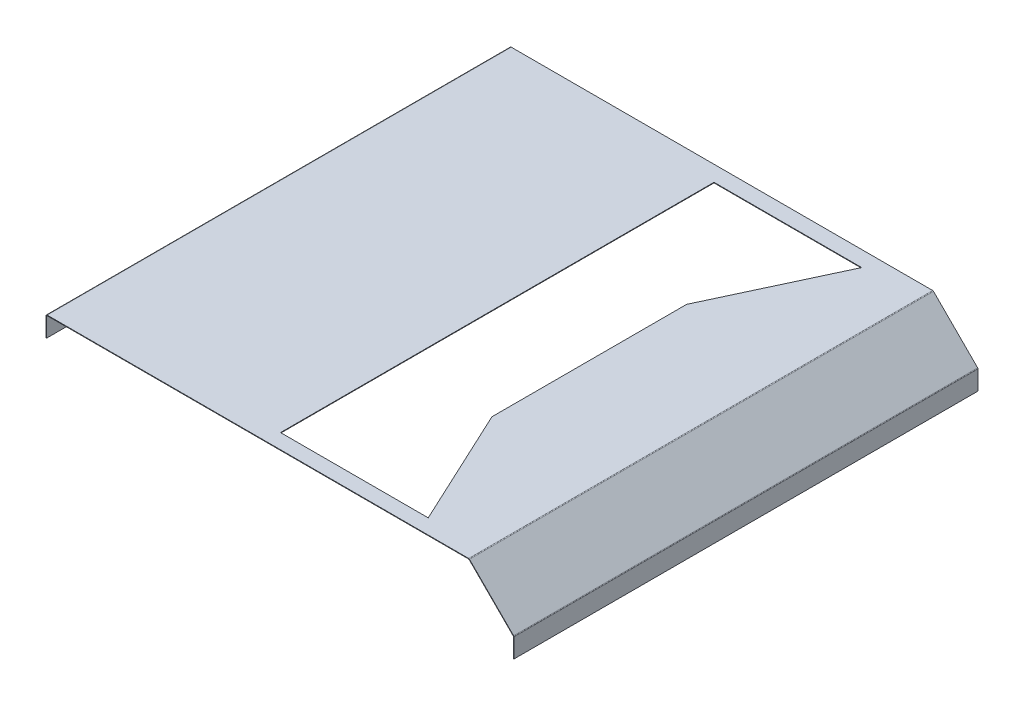
ISO-10303-21;
HEADER;
FILE_DESCRIPTION(('STEP AP214'),'2;1');
FILE_NAME('part.step','',(''),(''),'','','');
FILE_SCHEMA(('AUTOMOTIVE_DESIGN { 1 0 10303 214 1 1 1 1 }'));
ENDSEC;
DATA;
#1=APPLICATION_CONTEXT('core data for automotive mechanical design processes');
#2=APPLICATION_PROTOCOL_DEFINITION('international standard','automotive_design',2000,#1);
#3=PRODUCT_CONTEXT('',#1,'mechanical');
#4=PRODUCT('Part','Part','',(#3));
#5=PRODUCT_RELATED_PRODUCT_CATEGORY('part','',(#4));
#6=PRODUCT_DEFINITION_FORMATION('','',#4);
#7=PRODUCT_DEFINITION_CONTEXT('part definition',#1,'design');
#8=PRODUCT_DEFINITION('design','',#6,#7);
#9=PRODUCT_DEFINITION_SHAPE('','',#8);
#10=(LENGTH_UNIT() NAMED_UNIT(*) SI_UNIT(.MILLI.,.METRE.));
#11=(NAMED_UNIT(*) PLANE_ANGLE_UNIT() SI_UNIT($,.RADIAN.));
#12=(NAMED_UNIT(*) SI_UNIT($,.STERADIAN.) SOLID_ANGLE_UNIT());
#13=UNCERTAINTY_MEASURE_WITH_UNIT(LENGTH_MEASURE(1.E-05),#10,'distance_accuracy_value','');
#14=(GEOMETRIC_REPRESENTATION_CONTEXT(3) GLOBAL_UNCERTAINTY_ASSIGNED_CONTEXT((#13)) GLOBAL_UNIT_ASSIGNED_CONTEXT((#10,
#11,#12)) REPRESENTATION_CONTEXT('',''));
#15=CARTESIAN_POINT('',(0.,0.,0.));
#16=DIRECTION('',(0.,0.,1.));
#17=DIRECTION('',(1.,0.,0.));
#18=AXIS2_PLACEMENT_3D('',#15,#16,#17);
#19=CARTESIAN_POINT('',(336.465786437626,1.23691614312029E-13,741.4));
#20=DIRECTION('',(0.,0.,1.));
#21=DIRECTION('',(1.,0.,0.));
#22=AXIS2_PLACEMENT_3D('',#19,#20,#21);
#23=PLANE('',#22);
#24=DIRECTION('',(0.,1.,0.));
#25=VECTOR('',#24,1.);
#26=CARTESIAN_POINT('',(336.465786437626,1.23691614312029E-13,741.4));
#27=LINE('',#26,#25);
#28=CARTESIAN_POINT('',(336.465786437626,1.23691614312029E-13,741.4));
#29=VERTEX_POINT('',#28);
#30=CARTESIAN_POINT('',(336.465786437626,0.900000000000124,741.4));
#31=VERTEX_POINT('',#30);
#32=EDGE_CURVE('E13',#29,#31,#27,.T.);
#33=ORIENTED_EDGE('',*,*,#32,.F.);
#34=CARTESIAN_POINT('',(336.465786437626,-0.999999999999682,741.4));
#35=DIRECTION('',(0.,0.,1.));
#36=DIRECTION('',(1.,0.,0.));
#37=AXIS2_PLACEMENT_3D('',#34,#35,#36);
#38=CIRCLE('',#37,1.);
#39=CARTESIAN_POINT('',(337.172893218813,-0.292893218812915,741.4));
#40=VERTEX_POINT('',#39);
#41=EDGE_CURVE('E312',#40,#29,#38,.T.);
#42=ORIENTED_EDGE('',*,*,#41,.F.);
#43=DIRECTION('',(-0.707106781186521,-0.707106781186574,0.));
#44=VECTOR('',#43,1.);
#45=CARTESIAN_POINT('',(337.809289321881,0.343502884254838,741.4));
#46=LINE('',#45,#44);
#47=CARTESIAN_POINT('',(337.809289321881,0.343502884254838,741.4));
#48=VERTEX_POINT('',#47);
#49=EDGE_CURVE('E64',#48,#40,#46,.T.);
#50=ORIENTED_EDGE('',*,*,#49,.F.);
#51=CARTESIAN_POINT('',(336.465786437626,-0.999999999999682,741.4));
#52=DIRECTION('',(0.,0.,1.));
#53=DIRECTION('',(1.,0.,0.));
#54=AXIS2_PLACEMENT_3D('',#51,#52,#53);
#55=CIRCLE('',#54,1.9);
#56=EDGE_CURVE('E336',#48,#31,#55,.T.);
#57=ORIENTED_EDGE('',*,*,#56,.T.);
#58=EDGE_LOOP('',(#33,#42,#50,#57));
#59=FACE_BOUND('',#58,.T.);
#60=ADVANCED_FACE('F57',(#59),#23,.T.);
#61=CARTESIAN_POINT('',(337.809289321881,0.343502884254838,741.4));
#62=DIRECTION('',(0.,0.,1.));
#63=DIRECTION('',(1.,0.,0.));
#64=AXIS2_PLACEMENT_3D('',#61,#62,#63);
#65=PLANE('',#64);
#66=DIRECTION('',(-1.,0.,0.));
#67=VECTOR('',#66,1.);
#68=CARTESIAN_POINT('',(-336.88,0.,741.4));
#69=LINE('',#68,#67);
#70=CARTESIAN_POINT('',(-336.88,0.,741.4));
#71=VERTEX_POINT('',#70);
#72=EDGE_CURVE('E309',#29,#71,#69,.T.);
#73=ORIENTED_EDGE('',*,*,#72,.F.);
#74=ORIENTED_EDGE('',*,*,#32,.T.);
#75=DIRECTION('',(-1.,0.,0.));
#76=VECTOR('',#75,1.);
#77=CARTESIAN_POINT('',(-336.88,0.9,741.4));
#78=LINE('',#77,#76);
#79=CARTESIAN_POINT('',(-336.88,0.9,741.4));
#80=VERTEX_POINT('',#79);
#81=EDGE_CURVE('E303',#31,#80,#78,.T.);
#82=ORIENTED_EDGE('',*,*,#81,.T.);
#83=DIRECTION('',(0.,1.,0.));
#84=VECTOR('',#83,1.);
#85=CARTESIAN_POINT('',(-336.88,0.,741.4));
#86=LINE('',#85,#84);
#87=EDGE_CURVE('E305',#71,#80,#86,.T.);
#88=ORIENTED_EDGE('',*,*,#87,.F.);
#89=EDGE_LOOP('',(#73,#74,#82,#88));
#90=FACE_BOUND('',#89,.T.);
#91=ADVANCED_FACE('F474',(#90),#65,.T.);
#92=CARTESIAN_POINT('',(337.172893218813,-0.292893218812915,0.));
#93=DIRECTION('',(0.,0.,-1.));
#94=DIRECTION('',(-1.,0.,0.));
#95=AXIS2_PLACEMENT_3D('',#92,#93,#94);
#96=PLANE('',#95);
#97=DIRECTION('',(0.707106781186521,0.707106781186574,0.));
#98=VECTOR('',#97,1.);
#99=CARTESIAN_POINT('',(337.172893218813,-0.292893218812915,0.));
#100=LINE('',#99,#98);
#101=CARTESIAN_POINT('',(337.172893218813,-0.292893218812915,0.));
#102=VERTEX_POINT('',#101);
#103=CARTESIAN_POINT('',(337.809289321881,0.343502884254838,0.));
#104=VERTEX_POINT('',#103);
#105=EDGE_CURVE('E415',#102,#104,#100,.T.);
#106=ORIENTED_EDGE('',*,*,#105,.F.);
#107=CARTESIAN_POINT('',(336.465786437626,-0.999999999999682,0.));
#108=DIRECTION('',(0.,0.,1.));
#109=DIRECTION('',(1.,0.,0.));
#110=AXIS2_PLACEMENT_3D('',#107,#108,#109);
#111=CIRCLE('',#110,1.);
#112=CARTESIAN_POINT('',(336.465786437626,1.23691614312029E-13,0.));
#113=VERTEX_POINT('',#112);
#114=EDGE_CURVE('E347',#102,#113,#111,.T.);
#115=ORIENTED_EDGE('',*,*,#114,.T.);
#116=DIRECTION('',(0.,-1.,0.));
#117=VECTOR('',#116,1.);
#118=CARTESIAN_POINT('',(336.465786437626,0.900000000000124,0.));
#119=LINE('',#118,#117);
#120=CARTESIAN_POINT('',(336.465786437626,0.900000000000124,0.));
#121=VERTEX_POINT('',#120);
#122=EDGE_CURVE('E413',#121,#113,#119,.T.);
#123=ORIENTED_EDGE('',*,*,#122,.F.);
#124=CARTESIAN_POINT('',(336.465786437626,-0.999999999999682,0.));
#125=DIRECTION('',(0.,0.,1.));
#126=DIRECTION('',(1.,0.,0.));
#127=AXIS2_PLACEMENT_3D('',#124,#125,#126);
#128=CIRCLE('',#127,1.9);
#129=EDGE_CURVE('E306',#104,#121,#128,.T.);
#130=ORIENTED_EDGE('',*,*,#129,.F.);
#131=EDGE_LOOP('',(#106,#115,#123,#130));
#132=FACE_BOUND('',#131,.T.);
#133=ADVANCED_FACE('F523',(#132),#96,.T.);
#134=CARTESIAN_POINT('',(336.465786437626,0.900000000000124,0.));
#135=DIRECTION('',(0.,0.,-1.));
#136=DIRECTION('',(-1.,0.,0.));
#137=AXIS2_PLACEMENT_3D('',#134,#135,#136);
#138=PLANE('',#137);
#139=DIRECTION('',(-0.707106781186547,0.707106781186548,0.));
#140=VECTOR('',#139,1.);
#141=CARTESIAN_POINT('',(407.992994231491,-71.112994231491,0.));
#142=LINE('',#141,#140);
#143=CARTESIAN_POINT('',(407.700101012678,-70.8201010126776,0.));
#144=VERTEX_POINT('',#143);
#145=EDGE_CURVE('E350',#144,#102,#142,.T.);
#146=ORIENTED_EDGE('',*,*,#145,.T.);
#147=ORIENTED_EDGE('',*,*,#105,.T.);
#148=DIRECTION('',(-0.707106781186547,0.707106781186548,0.));
#149=VECTOR('',#148,1.);
#150=CARTESIAN_POINT('',(408.629390334559,-70.4765981284231,0.));
#151=LINE('',#150,#149);
#152=CARTESIAN_POINT('',(408.336497115745,-70.1837049096097,0.));
#153=VERTEX_POINT('',#152);
#154=EDGE_CURVE('E368',#153,#104,#151,.T.);
#155=ORIENTED_EDGE('',*,*,#154,.F.);
#156=DIRECTION('',(-0.707106781186532,-0.707106781186563,0.));
#157=VECTOR('',#156,1.);
#158=CARTESIAN_POINT('',(408.336497115745,-70.1837049096097,0.));
#159=LINE('',#158,#157);
#160=EDGE_CURVE('E405',#153,#144,#159,.T.);
#161=ORIENTED_EDGE('',*,*,#160,.T.);
#162=EDGE_LOOP('',(#146,#147,#155,#161));
#163=FACE_BOUND('',#162,.T.);
#164=ADVANCED_FACE('F527',(#163),#138,.T.);
#165=CARTESIAN_POINT('',(407.700101012678,-70.8201010126776,741.4));
#166=DIRECTION('',(0.,0.,1.));
#167=DIRECTION('',(1.,0.,0.));
#168=AXIS2_PLACEMENT_3D('',#165,#166,#167);
#169=PLANE('',#168);
#170=DIRECTION('',(0.707106781186532,0.707106781186563,0.));
#171=VECTOR('',#170,1.);
#172=CARTESIAN_POINT('',(407.700101012678,-70.8201010126776,741.4));
#173=LINE('',#172,#171);
#174=CARTESIAN_POINT('',(407.700101012678,-70.8201010126776,741.4));
#175=VERTEX_POINT('',#174);
#176=CARTESIAN_POINT('',(408.336497115745,-70.1837049096097,741.4));
#177=VERTEX_POINT('',#176);
#178=EDGE_CURVE('E411',#175,#177,#173,.T.);
#179=ORIENTED_EDGE('',*,*,#178,.F.);
#180=CARTESIAN_POINT('',(406.992994231491,-71.5272077938642,741.4));
#181=DIRECTION('',(0.,0.,1.));
#182=DIRECTION('',(1.,0.,0.));
#183=AXIS2_PLACEMENT_3D('',#180,#181,#182);
#184=CIRCLE('',#183,1.);
#185=CARTESIAN_POINT('',(407.992994231491,-71.5272077938642,741.4));
#186=VERTEX_POINT('',#185);
#187=EDGE_CURVE('E318',#186,#175,#184,.T.);
#188=ORIENTED_EDGE('',*,*,#187,.F.);
#189=DIRECTION('',(-1.,0.,0.));
#190=VECTOR('',#189,1.);
#191=CARTESIAN_POINT('',(408.892994231491,-71.5272077938642,741.4));
#192=LINE('',#191,#190);
#193=CARTESIAN_POINT('',(408.892994231491,-71.5272077938642,741.4));
#194=VERTEX_POINT('',#193);
#195=EDGE_CURVE('E409',#194,#186,#192,.T.);
#196=ORIENTED_EDGE('',*,*,#195,.F.);
#197=CARTESIAN_POINT('',(406.992994231491,-71.5272077938642,741.4));
#198=DIRECTION('',(0.,0.,1.));
#199=DIRECTION('',(1.,0.,0.));
#200=AXIS2_PLACEMENT_3D('',#197,#198,#199);
#201=CIRCLE('',#200,1.9);
#202=EDGE_CURVE('E330',#194,#177,#201,.T.);
#203=ORIENTED_EDGE('',*,*,#202,.T.);
#204=EDGE_LOOP('',(#179,#188,#196,#203));
#205=FACE_BOUND('',#204,.T.);
#206=ADVANCED_FACE('F438',(#205),#169,.T.);
#207=CARTESIAN_POINT('',(408.892994231491,-71.5272077938642,741.4));
#208=DIRECTION('',(0.,0.,1.));
#209=DIRECTION('',(1.,0.,0.));
#210=AXIS2_PLACEMENT_3D('',#207,#208,#209);
#211=PLANE('',#210);
#212=DIRECTION('',(-0.707106781186547,0.707106781186548,0.));
#213=VECTOR('',#212,1.);
#214=CARTESIAN_POINT('',(407.992994231491,-71.112994231491,741.4));
#215=LINE('',#214,#213);
#216=EDGE_CURVE('E315',#175,#40,#215,.T.);
#217=ORIENTED_EDGE('',*,*,#216,.F.);
#218=ORIENTED_EDGE('',*,*,#178,.T.);
#219=DIRECTION('',(-0.707106781186547,0.707106781186548,0.));
#220=VECTOR('',#219,1.);
#221=CARTESIAN_POINT('',(408.629390334559,-70.4765981284231,741.4));
#222=LINE('',#221,#220);
#223=EDGE_CURVE('E333',#177,#48,#222,.T.);
#224=ORIENTED_EDGE('',*,*,#223,.T.);
#225=ORIENTED_EDGE('',*,*,#49,.T.);
#226=EDGE_LOOP('',(#217,#218,#224,#225));
#227=FACE_BOUND('',#226,.T.);
#228=ADVANCED_FACE('F419',(#227),#211,.T.);
#229=CARTESIAN_POINT('',(407.992994231491,-71.5272077938642,0.));
#230=DIRECTION('',(0.,0.,-1.));
#231=DIRECTION('',(-1.,0.,0.));
#232=AXIS2_PLACEMENT_3D('',#229,#230,#231);
#233=PLANE('',#232);
#234=DIRECTION('',(1.,0.,0.));
#235=VECTOR('',#234,1.);
#236=CARTESIAN_POINT('',(407.992994231491,-71.5272077938642,0.));
#237=LINE('',#236,#235);
#238=CARTESIAN_POINT('',(407.992994231491,-71.5272077938642,0.));
#239=VERTEX_POINT('',#238);
#240=CARTESIAN_POINT('',(408.892994231491,-71.5272077938642,0.));
#241=VERTEX_POINT('',#240);
#242=EDGE_CURVE('E407',#239,#241,#237,.T.);
#243=ORIENTED_EDGE('',*,*,#242,.F.);
#244=CARTESIAN_POINT('',(406.992994231491,-71.5272077938642,0.));
#245=DIRECTION('',(0.,0.,1.));
#246=DIRECTION('',(1.,0.,0.));
#247=AXIS2_PLACEMENT_3D('',#244,#245,#246);
#248=CIRCLE('',#247,1.);
#249=EDGE_CURVE('E353',#239,#144,#248,.T.);
#250=ORIENTED_EDGE('',*,*,#249,.T.);
#251=ORIENTED_EDGE('',*,*,#160,.F.);
#252=CARTESIAN_POINT('',(406.992994231491,-71.5272077938642,0.));
#253=DIRECTION('',(0.,0.,1.));
#254=DIRECTION('',(1.,0.,0.));
#255=AXIS2_PLACEMENT_3D('',#252,#253,#254);
#256=CIRCLE('',#255,1.9);
#257=EDGE_CURVE('E365',#241,#153,#256,.T.);
#258=ORIENTED_EDGE('',*,*,#257,.F.);
#259=EDGE_LOOP('',(#243,#250,#251,#258));
#260=FACE_BOUND('',#259,.T.);
#261=ADVANCED_FACE('F538',(#260),#233,.T.);
#262=CARTESIAN_POINT('',(408.336497115745,-70.1837049096097,0.));
#263=DIRECTION('',(0.,0.,-1.));
#264=DIRECTION('',(-1.,0.,0.));
#265=AXIS2_PLACEMENT_3D('',#262,#263,#264);
#266=PLANE('',#265);
#267=DIRECTION('',(0.,1.,0.));
#268=VECTOR('',#267,1.);
#269=CARTESIAN_POINT('',(407.992994231491,-102.112994231491,0.));
#270=LINE('',#269,#268);
#271=CARTESIAN_POINT('',(407.992994231491,-102.112994231491,0.));
#272=VERTEX_POINT('',#271);
#273=EDGE_CURVE('E356',#272,#239,#270,.T.);
#274=ORIENTED_EDGE('',*,*,#273,.T.);
#275=ORIENTED_EDGE('',*,*,#242,.T.);
#276=DIRECTION('',(0.,1.,0.));
#277=VECTOR('',#276,1.);
#278=CARTESIAN_POINT('',(408.892994231491,-102.112994231491,0.));
#279=LINE('',#278,#277);
#280=CARTESIAN_POINT('',(408.892994231491,-102.112994231491,0.));
#281=VERTEX_POINT('',#280);
#282=EDGE_CURVE('E362',#281,#241,#279,.T.);
#283=ORIENTED_EDGE('',*,*,#282,.F.);
#284=DIRECTION('',(-1.,0.,0.));
#285=VECTOR('',#284,1.);
#286=CARTESIAN_POINT('',(408.892994231491,-102.112994231491,0.));
#287=LINE('',#286,#285);
#288=EDGE_CURVE('E359',#281,#272,#287,.T.);
#289=ORIENTED_EDGE('',*,*,#288,.T.);
#290=EDGE_LOOP('',(#274,#275,#283,#289));
#291=FACE_BOUND('',#290,.T.);
#292=ADVANCED_FACE('F541',(#291),#266,.T.);
#293=CARTESIAN_POINT('',(-336.88,0.9,741.4));
#294=DIRECTION('',(0.,-1.,0.));
#295=DIRECTION('',(1.,0.,0.));
#296=AXIS2_PLACEMENT_3D('',#293,#294,#295);
#297=PLANE('',#296);
#298=DIRECTION('',(-0.422618261740693,0.,0.906307787036653));
#299=VECTOR('',#298,1.);
#300=CARTESIAN_POINT('',(-130.810811155167,0.900000000000038,837.491640868132));
#301=LINE('',#300,#299);
#302=CARTESIAN_POINT('',(248.0602631686,0.900000000000086,24.9999999999069));
#303=VERTEX_POINT('',#302);
#304=CARTESIAN_POINT('',(159.117677791367,0.900000000000099,215.7379898694));
#305=VERTEX_POINT('',#304);
#306=EDGE_CURVE('E252',#303,#305,#301,.T.);
#307=ORIENTED_EDGE('',*,*,#306,.T.);
#308=DIRECTION('',(0.,0.,1.));
#309=VECTOR('',#308,1.);
#310=CARTESIAN_POINT('',(159.117677791367,0.900000000000091,741.4));
#311=LINE('',#310,#309);
#312=CARTESIAN_POINT('',(159.117677791367,0.900000000000099,526.822723001546));
#313=VERTEX_POINT('',#312);
#314=EDGE_CURVE('E255',#305,#313,#311,.T.);
#315=ORIENTED_EDGE('',*,*,#314,.T.);
#316=DIRECTION('',(0.422618261740693,0.,0.906307787036653));
#317=VECTOR('',#316,1.);
#318=CARTESIAN_POINT('',(152.717285086612,0.90000000000009,513.097036552221));
#319=LINE('',#318,#317);
#320=CARTESIAN_POINT('',(248.060263168601,0.900000000000107,717.56071287104));
#321=VERTEX_POINT('',#320);
#322=EDGE_CURVE('E237',#313,#321,#319,.T.);
#323=ORIENTED_EDGE('',*,*,#322,.T.);
#324=DIRECTION('',(-1.,0.,0.));
#325=VECTOR('',#324,1.);
#326=CARTESIAN_POINT('',(-336.88,0.9,717.560712871038));
#327=LINE('',#326,#325);
#328=CARTESIAN_POINT('',(12.1200000000167,0.900000000000086,717.560712871039));
#329=VERTEX_POINT('',#328);
#330=EDGE_CURVE('E210',#321,#329,#327,.T.);
#331=ORIENTED_EDGE('',*,*,#330,.T.);
#332=DIRECTION('',(0.,0.,-1.));
#333=VECTOR('',#332,1.);
#334=CARTESIAN_POINT('',(12.1200000000168,0.900000000000064,741.399999999999));
#335=LINE('',#334,#333);
#336=CARTESIAN_POINT('',(12.1200000000141,0.900000000000064,24.9999999999074));
#337=VERTEX_POINT('',#336);
#338=EDGE_CURVE('E246',#329,#337,#335,.T.);
#339=ORIENTED_EDGE('',*,*,#338,.T.);
#340=DIRECTION('',(1.,0.,0.));
#341=VECTOR('',#340,1.);
#342=CARTESIAN_POINT('',(-336.880000000002,0.9,24.9999999999082));
#343=LINE('',#342,#341);
#344=EDGE_CURVE('E249',#337,#303,#343,.T.);
#345=ORIENTED_EDGE('',*,*,#344,.T.);
#346=EDGE_LOOP('',(#307,#315,#323,#331,#339,#345));
#347=FACE_BOUND('',#346,.T.);
#348=DIRECTION('',(-1.,0.,0.));
#349=VECTOR('',#348,1.);
#350=CARTESIAN_POINT('',(-336.88,0.9,0.));
#351=LINE('',#350,#349);
#352=CARTESIAN_POINT('',(-336.88,0.899999999999996,0.));
#353=VERTEX_POINT('',#352);
#354=EDGE_CURVE('E294',#121,#353,#351,.T.);
#355=ORIENTED_EDGE('',*,*,#354,.T.);
#356=DIRECTION('',(0.,0.,-1.));
#357=VECTOR('',#356,1.);
#358=CARTESIAN_POINT('',(-336.88,0.9,741.4));
#359=LINE('',#358,#357);
#360=EDGE_CURVE('E402',#80,#353,#359,.T.);
#361=ORIENTED_EDGE('',*,*,#360,.F.);
#362=ORIENTED_EDGE('',*,*,#81,.F.);
#363=DIRECTION('',(0.,0.,-1.));
#364=VECTOR('',#363,1.);
#365=CARTESIAN_POINT('',(336.465786437626,0.900000000000124,741.4));
#366=LINE('',#365,#364);
#367=EDGE_CURVE('E339',#31,#121,#366,.T.);
#368=ORIENTED_EDGE('',*,*,#367,.T.);
#369=EDGE_LOOP('',(#355,#361,#362,#368));
#370=FACE_BOUND('',#369,.T.);
#371=ADVANCED_FACE('F471',(#347,#370),#297,.F.);
#372=CARTESIAN_POINT('',(-336.88,0.,741.4));
#373=DIRECTION('',(0.,-1.,0.));
#374=DIRECTION('',(1.,0.,0.));
#375=AXIS2_PLACEMENT_3D('',#372,#373,#374);
#376=PLANE('',#375);
#377=DIRECTION('',(0.,0.,1.));
#378=VECTOR('',#377,1.);
#379=CARTESIAN_POINT('',(159.117677791367,0.,215.7379898694));
#380=LINE('',#379,#378);
#381=CARTESIAN_POINT('',(159.117677791367,0.,215.7379898694));
#382=VERTEX_POINT('',#381);
#383=CARTESIAN_POINT('',(159.117677791367,0.,526.822723001546));
#384=VERTEX_POINT('',#383);
#385=EDGE_CURVE('E79',#382,#384,#380,.T.);
#386=ORIENTED_EDGE('',*,*,#385,.F.);
#387=DIRECTION('',(-0.422618261740693,0.,0.906307787036653));
#388=VECTOR('',#387,1.);
#389=CARTESIAN_POINT('',(248.0602631686,0.,24.9999999999069));
#390=LINE('',#389,#388);
#391=CARTESIAN_POINT('',(248.0602631686,0.,24.9999999999069));
#392=VERTEX_POINT('',#391);
#393=EDGE_CURVE('E232',#392,#382,#390,.T.);
#394=ORIENTED_EDGE('',*,*,#393,.F.);
#395=DIRECTION('',(1.,0.,0.));
#396=VECTOR('',#395,1.);
#397=CARTESIAN_POINT('',(12.1200000000141,0.,24.9999999999074));
#398=LINE('',#397,#396);
#399=CARTESIAN_POINT('',(12.1200000000141,0.,24.9999999999074));
#400=VERTEX_POINT('',#399);
#401=EDGE_CURVE('E226',#400,#392,#398,.T.);
#402=ORIENTED_EDGE('',*,*,#401,.F.);
#403=DIRECTION('',(0.,0.,-1.));
#404=VECTOR('',#403,1.);
#405=CARTESIAN_POINT('',(12.1200000000167,0.,717.560712871039));
#406=LINE('',#405,#404);
#407=CARTESIAN_POINT('',(12.1200000000167,0.,717.560712871039));
#408=VERTEX_POINT('',#407);
#409=EDGE_CURVE('E224',#408,#400,#406,.T.);
#410=ORIENTED_EDGE('',*,*,#409,.F.);
#411=DIRECTION('',(-1.,0.,0.));
#412=VECTOR('',#411,1.);
#413=CARTESIAN_POINT('',(248.060263168601,0.,717.56071287104));
#414=LINE('',#413,#412);
#415=CARTESIAN_POINT('',(248.060263168601,0.,717.56071287104));
#416=VERTEX_POINT('',#415);
#417=EDGE_CURVE('E207',#416,#408,#414,.T.);
#418=ORIENTED_EDGE('',*,*,#417,.F.);
#419=DIRECTION('',(0.422618261740693,0.,0.906307787036653));
#420=VECTOR('',#419,1.);
#421=CARTESIAN_POINT('',(159.117677791367,0.,526.822723001546));
#422=LINE('',#421,#420);
#423=EDGE_CURVE('E216',#384,#416,#422,.T.);
#424=ORIENTED_EDGE('',*,*,#423,.F.);
#425=EDGE_LOOP('',(#386,#394,#402,#410,#418,#424));
#426=FACE_BOUND('',#425,.T.);
#427=DIRECTION('',(-1.,0.,0.));
#428=VECTOR('',#427,1.);
#429=CARTESIAN_POINT('',(-336.88,0.,0.));
#430=LINE('',#429,#428);
#431=CARTESIAN_POINT('',(-336.88,0.,0.));
#432=VERTEX_POINT('',#431);
#433=EDGE_CURVE('E344',#113,#432,#430,.T.);
#434=ORIENTED_EDGE('',*,*,#433,.F.);
#435=DIRECTION('',(0.,0.,-1.));
#436=VECTOR('',#435,1.);
#437=CARTESIAN_POINT('',(336.465786437626,1.23691614312029E-13,741.4));
#438=LINE('',#437,#436);
#439=EDGE_CURVE('E397',#29,#113,#438,.T.);
#440=ORIENTED_EDGE('',*,*,#439,.F.);
#441=ORIENTED_EDGE('',*,*,#72,.T.);
#442=DIRECTION('',(0.,0.,-1.));
#443=VECTOR('',#442,1.);
#444=CARTESIAN_POINT('',(-336.88,0.,741.4));
#445=LINE('',#444,#443);
#446=EDGE_CURVE('E400',#71,#432,#445,.T.);
#447=ORIENTED_EDGE('',*,*,#446,.T.);
#448=EDGE_LOOP('',(#434,#440,#441,#447));
#449=FACE_BOUND('',#448,.T.);
#450=ADVANCED_FACE('F220',(#426,#449),#376,.T.);
#451=CARTESIAN_POINT('',(336.465786437626,-0.999999999999682,741.4));
#452=DIRECTION('',(0.,0.,-1.));
#453=DIRECTION('',(-1.,0.,0.));
#454=AXIS2_PLACEMENT_3D('',#451,#452,#453);
#455=CYLINDRICAL_SURFACE('',#454,1.);
#456=ORIENTED_EDGE('',*,*,#114,.F.);
#457=DIRECTION('',(0.,0.,-1.));
#458=VECTOR('',#457,1.);
#459=CARTESIAN_POINT('',(337.172893218813,-0.292893218812915,741.4));
#460=LINE('',#459,#458);
#461=EDGE_CURVE('E394',#40,#102,#460,.T.);
#462=ORIENTED_EDGE('',*,*,#461,.F.);
#463=ORIENTED_EDGE('',*,*,#41,.T.);
#464=ORIENTED_EDGE('',*,*,#439,.T.);
#465=EDGE_LOOP('',(#456,#462,#463,#464));
#466=FACE_BOUND('',#465,.T.);
#467=ADVANCED_FACE('F426',(#466),#455,.F.);
#468=CARTESIAN_POINT('',(407.992994231491,-71.112994231491,741.4));
#469=DIRECTION('',(-0.707106781186548,-0.707106781186547,0.));
#470=DIRECTION('',(0.707106781186547,-0.707106781186548,0.));
#471=AXIS2_PLACEMENT_3D('',#468,#469,#470);
#472=PLANE('',#471);
#473=ORIENTED_EDGE('',*,*,#145,.F.);
#474=DIRECTION('',(0.,0.,-1.));
#475=VECTOR('',#474,1.);
#476=CARTESIAN_POINT('',(407.700101012678,-70.8201010126776,741.4));
#477=LINE('',#476,#475);
#478=EDGE_CURVE('E391',#175,#144,#477,.T.);
#479=ORIENTED_EDGE('',*,*,#478,.F.);
#480=ORIENTED_EDGE('',*,*,#216,.T.);
#481=ORIENTED_EDGE('',*,*,#461,.T.);
#482=EDGE_LOOP('',(#473,#479,#480,#481));
#483=FACE_BOUND('',#482,.T.);
#484=ADVANCED_FACE('F431',(#483),#472,.T.);
#485=CARTESIAN_POINT('',(406.992994231491,-71.5272077938642,741.4));
#486=DIRECTION('',(0.,0.,-1.));
#487=DIRECTION('',(-1.,0.,0.));
#488=AXIS2_PLACEMENT_3D('',#485,#486,#487);
#489=CYLINDRICAL_SURFACE('',#488,1.);
#490=ORIENTED_EDGE('',*,*,#249,.F.);
#491=DIRECTION('',(0.,0.,-1.));
#492=VECTOR('',#491,1.);
#493=CARTESIAN_POINT('',(407.992994231491,-71.5272077938642,741.4));
#494=LINE('',#493,#492);
#495=EDGE_CURVE('E388',#186,#239,#494,.T.);
#496=ORIENTED_EDGE('',*,*,#495,.F.);
#497=ORIENTED_EDGE('',*,*,#187,.T.);
#498=ORIENTED_EDGE('',*,*,#478,.T.);
#499=EDGE_LOOP('',(#490,#496,#497,#498));
#500=FACE_BOUND('',#499,.T.);
#501=ADVANCED_FACE('F434',(#500),#489,.F.);
#502=CARTESIAN_POINT('',(407.992994231491,-102.112994231491,741.4));
#503=DIRECTION('',(-1.,0.,0.));
#504=DIRECTION('',(0.,-1.,0.));
#505=AXIS2_PLACEMENT_3D('',#502,#503,#504);
#506=PLANE('',#505);
#507=ORIENTED_EDGE('',*,*,#273,.F.);
#508=DIRECTION('',(0.,0.,-1.));
#509=VECTOR('',#508,1.);
#510=CARTESIAN_POINT('',(407.992994231491,-102.112994231491,741.4));
#511=LINE('',#510,#509);
#512=CARTESIAN_POINT('',(407.992994231491,-102.112994231491,741.4));
#513=VERTEX_POINT('',#512);
#514=EDGE_CURVE('E386',#513,#272,#511,.T.);
#515=ORIENTED_EDGE('',*,*,#514,.F.);
#516=DIRECTION('',(0.,1.,0.));
#517=VECTOR('',#516,1.);
#518=CARTESIAN_POINT('',(407.992994231491,-102.112994231491,741.4));
#519=LINE('',#518,#517);
#520=EDGE_CURVE('E321',#513,#186,#519,.T.);
#521=ORIENTED_EDGE('',*,*,#520,.T.);
#522=ORIENTED_EDGE('',*,*,#495,.T.);
#523=EDGE_LOOP('',(#507,#515,#521,#522));
#524=FACE_BOUND('',#523,.T.);
#525=ADVANCED_FACE('F442',(#524),#506,.T.);
#526=CARTESIAN_POINT('',(408.892994231491,-102.112994231491,741.4));
#527=DIRECTION('',(0.,-1.,0.));
#528=DIRECTION('',(0.,0.,-1.));
#529=AXIS2_PLACEMENT_3D('',#526,#527,#528);
#530=PLANE('',#529);
#531=ORIENTED_EDGE('',*,*,#288,.F.);
#532=DIRECTION('',(0.,0.,-1.));
#533=VECTOR('',#532,1.);
#534=CARTESIAN_POINT('',(408.892994231491,-102.112994231491,741.4));
#535=LINE('',#534,#533);
#536=CARTESIAN_POINT('',(408.892994231491,-102.112994231491,741.4));
#537=VERTEX_POINT('',#536);
#538=EDGE_CURVE('E384',#537,#281,#535,.T.);
#539=ORIENTED_EDGE('',*,*,#538,.F.);
#540=DIRECTION('',(-1.,0.,0.));
#541=VECTOR('',#540,1.);
#542=CARTESIAN_POINT('',(408.892994231491,-102.112994231491,741.4));
#543=LINE('',#542,#541);
#544=EDGE_CURVE('E324',#537,#513,#543,.T.);
#545=ORIENTED_EDGE('',*,*,#544,.T.);
#546=ORIENTED_EDGE('',*,*,#514,.T.);
#547=EDGE_LOOP('',(#531,#539,#545,#546));
#548=FACE_BOUND('',#547,.T.);
#549=ADVANCED_FACE('F448',(#548),#530,.T.);
#550=CARTESIAN_POINT('',(408.892994231491,-102.112994231491,741.4));
#551=DIRECTION('',(-1.,0.,0.));
#552=DIRECTION('',(0.,-1.,0.));
#553=AXIS2_PLACEMENT_3D('',#550,#551,#552);
#554=PLANE('',#553);
#555=ORIENTED_EDGE('',*,*,#282,.T.);
#556=DIRECTION('',(0.,0.,-1.));
#557=VECTOR('',#556,1.);
#558=CARTESIAN_POINT('',(408.892994231491,-71.5272077938642,741.4));
#559=LINE('',#558,#557);
#560=EDGE_CURVE('E381',#194,#241,#559,.T.);
#561=ORIENTED_EDGE('',*,*,#560,.F.);
#562=DIRECTION('',(0.,1.,0.));
#563=VECTOR('',#562,1.);
#564=CARTESIAN_POINT('',(408.892994231491,-102.112994231491,741.4));
#565=LINE('',#564,#563);
#566=EDGE_CURVE('E327',#537,#194,#565,.T.);
#567=ORIENTED_EDGE('',*,*,#566,.F.);
#568=ORIENTED_EDGE('',*,*,#538,.T.);
#569=EDGE_LOOP('',(#555,#561,#567,#568));
#570=FACE_BOUND('',#569,.T.);
#571=ADVANCED_FACE('F453',(#570),#554,.F.);
#572=CARTESIAN_POINT('',(406.992994231491,-71.5272077938642,741.4));
#573=DIRECTION('',(0.,0.,-1.));
#574=DIRECTION('',(-1.,0.,0.));
#575=AXIS2_PLACEMENT_3D('',#572,#573,#574);
#576=CYLINDRICAL_SURFACE('',#575,1.9);
#577=ORIENTED_EDGE('',*,*,#257,.T.);
#578=DIRECTION('',(0.,0.,-1.));
#579=VECTOR('',#578,1.);
#580=CARTESIAN_POINT('',(408.336497115745,-70.1837049096097,741.4));
#581=LINE('',#580,#579);
#582=EDGE_CURVE('E378',#177,#153,#581,.T.);
#583=ORIENTED_EDGE('',*,*,#582,.F.);
#584=ORIENTED_EDGE('',*,*,#202,.F.);
#585=ORIENTED_EDGE('',*,*,#560,.T.);
#586=EDGE_LOOP('',(#577,#583,#584,#585));
#587=FACE_BOUND('',#586,.T.);
#588=ADVANCED_FACE('F458',(#587),#576,.T.);
#589=CARTESIAN_POINT('',(408.629390334559,-70.4765981284231,741.4));
#590=DIRECTION('',(-0.707106781186548,-0.707106781186547,0.));
#591=DIRECTION('',(0.707106781186547,-0.707106781186548,0.));
#592=AXIS2_PLACEMENT_3D('',#589,#590,#591);
#593=PLANE('',#592);
#594=ORIENTED_EDGE('',*,*,#154,.T.);
#595=DIRECTION('',(0.,0.,-1.));
#596=VECTOR('',#595,1.);
#597=CARTESIAN_POINT('',(337.809289321881,0.343502884254838,741.4));
#598=LINE('',#597,#596);
#599=EDGE_CURVE('E375',#48,#104,#598,.T.);
#600=ORIENTED_EDGE('',*,*,#599,.F.);
#601=ORIENTED_EDGE('',*,*,#223,.F.);
#602=ORIENTED_EDGE('',*,*,#582,.T.);
#603=EDGE_LOOP('',(#594,#600,#601,#602));
#604=FACE_BOUND('',#603,.T.);
#605=ADVANCED_FACE('F461',(#604),#593,.F.);
#606=CARTESIAN_POINT('',(336.465786437626,-0.999999999999682,741.4));
#607=DIRECTION('',(0.,0.,-1.));
#608=DIRECTION('',(-1.,0.,0.));
#609=AXIS2_PLACEMENT_3D('',#606,#607,#608);
#610=CYLINDRICAL_SURFACE('',#609,1.9);
#611=ORIENTED_EDGE('',*,*,#129,.T.);
#612=ORIENTED_EDGE('',*,*,#367,.F.);
#613=ORIENTED_EDGE('',*,*,#56,.F.);
#614=ORIENTED_EDGE('',*,*,#599,.T.);
#615=EDGE_LOOP('',(#611,#612,#613,#614));
#616=FACE_BOUND('',#615,.T.);
#617=ADVANCED_FACE('F466',(#616),#610,.T.);
#618=CARTESIAN_POINT('',(336.465786437626,-0.999999999999682,741.4));
#619=DIRECTION('',(0.,0.,1.));
#620=DIRECTION('',(1.,0.,0.));
#621=AXIS2_PLACEMENT_3D('',#618,#619,#620);
#622=PLANE('',#621);
#623=ORIENTED_EDGE('',*,*,#566,.T.);
#624=ORIENTED_EDGE('',*,*,#195,.T.);
#625=ORIENTED_EDGE('',*,*,#520,.F.);
#626=ORIENTED_EDGE('',*,*,#544,.F.);
#627=EDGE_LOOP('',(#623,#624,#625,#626));
#628=FACE_BOUND('',#627,.T.);
#629=ADVANCED_FACE('F445',(#628),#622,.T.);
#630=CARTESIAN_POINT('',(336.465786437626,-0.999999999999682,0.));
#631=DIRECTION('',(0.,0.,1.));
#632=DIRECTION('',(1.,0.,0.));
#633=AXIS2_PLACEMENT_3D('',#630,#631,#632);
#634=PLANE('',#633);
#635=ORIENTED_EDGE('',*,*,#354,.F.);
#636=ORIENTED_EDGE('',*,*,#122,.T.);
#637=ORIENTED_EDGE('',*,*,#433,.T.);
#638=DIRECTION('',(0.,1.,0.));
#639=VECTOR('',#638,1.);
#640=CARTESIAN_POINT('',(-336.88,0.,0.));
#641=LINE('',#640,#639);
#642=EDGE_CURVE('E342',#432,#353,#641,.T.);
#643=ORIENTED_EDGE('',*,*,#642,.T.);
#644=EDGE_LOOP('',(#635,#636,#637,#643));
#645=FACE_BOUND('',#644,.T.);
#646=ADVANCED_FACE('F507',(#645),#634,.F.);
#647=CARTESIAN_POINT('',(-336.88,-1.,741.4));
#648=DIRECTION('',(0.,0.,1.));
#649=DIRECTION('',(1.,0.,0.));
#650=AXIS2_PLACEMENT_3D('',#647,#648,#649);
#651=PLANE('',#650);
#652=DIRECTION('',(-1.,0.,0.));
#653=VECTOR('',#652,1.);
#654=CARTESIAN_POINT('',(-338.78,-0.999999999999997,741.4));
#655=LINE('',#654,#653);
#656=CARTESIAN_POINT('',(-337.88,-1.,741.4));
#657=VERTEX_POINT('',#656);
#658=CARTESIAN_POINT('',(-338.78,-0.999999999999998,741.4));
#659=VERTEX_POINT('',#658);
#660=EDGE_CURVE('E258',#657,#659,#655,.T.);
#661=ORIENTED_EDGE('',*,*,#660,.F.);
#662=CARTESIAN_POINT('',(-336.88,-1.,741.4));
#663=DIRECTION('',(0.,0.,-1.));
#664=DIRECTION('',(-1.,0.,0.));
#665=AXIS2_PLACEMENT_3D('',#662,#663,#664);
#666=CIRCLE('',#665,1.);
#667=EDGE_CURVE('E298',#71,#657,#666,.F.);
#668=ORIENTED_EDGE('',*,*,#667,.F.);
#669=ORIENTED_EDGE('',*,*,#87,.T.);
#670=CARTESIAN_POINT('',(-336.88,-1.,741.4));
#671=DIRECTION('',(0.,0.,-1.));
#672=DIRECTION('',(-1.,0.,0.));
#673=AXIS2_PLACEMENT_3D('',#670,#671,#672);
#674=CIRCLE('',#673,1.9);
#675=EDGE_CURVE('E291',#80,#659,#674,.F.);
#676=ORIENTED_EDGE('',*,*,#675,.T.);
#677=EDGE_LOOP('',(#661,#668,#669,#676));
#678=FACE_BOUND('',#677,.T.);
#679=ADVANCED_FACE('F483',(#678),#651,.T.);
#680=CARTESIAN_POINT('',(-336.88,-1.,0.));
#681=DIRECTION('',(0.,0.,1.));
#682=DIRECTION('',(1.,0.,0.));
#683=AXIS2_PLACEMENT_3D('',#680,#681,#682);
#684=PLANE('',#683);
#685=CARTESIAN_POINT('',(-336.88,-1.,0.));
#686=DIRECTION('',(0.,0.,-1.));
#687=DIRECTION('',(-1.,0.,0.));
#688=AXIS2_PLACEMENT_3D('',#685,#686,#687);
#689=CIRCLE('',#688,1.);
#690=CARTESIAN_POINT('',(-337.88,-1.,0.));
#691=VERTEX_POINT('',#690);
#692=EDGE_CURVE('E261',#691,#432,#689,.T.);
#693=ORIENTED_EDGE('',*,*,#692,.F.);
#694=DIRECTION('',(-1.,0.,0.));
#695=VECTOR('',#694,1.);
#696=CARTESIAN_POINT('',(-337.88,-1.,0.));
#697=LINE('',#696,#695);
#698=CARTESIAN_POINT('',(-338.78,-0.999999999999998,0.));
#699=VERTEX_POINT('',#698);
#700=EDGE_CURVE('E284',#691,#699,#697,.T.);
#701=ORIENTED_EDGE('',*,*,#700,.T.);
#702=CARTESIAN_POINT('',(-336.88,-1.,0.));
#703=DIRECTION('',(0.,0.,-1.));
#704=DIRECTION('',(-1.,0.,0.));
#705=AXIS2_PLACEMENT_3D('',#702,#703,#704);
#706=CIRCLE('',#705,1.9);
#707=EDGE_CURVE('E295',#699,#353,#706,.T.);
#708=ORIENTED_EDGE('',*,*,#707,.T.);
#709=ORIENTED_EDGE('',*,*,#642,.F.);
#710=EDGE_LOOP('',(#693,#701,#708,#709));
#711=FACE_BOUND('',#710,.T.);
#712=ADVANCED_FACE('F504',(#711),#684,.F.);
#713=CARTESIAN_POINT('',(-336.88,-1.,0.));
#714=DIRECTION('',(0.,0.,-1.));
#715=DIRECTION('',(-1.,0.,0.));
#716=AXIS2_PLACEMENT_3D('',#713,#714,#715);
#717=CYLINDRICAL_SURFACE('',#716,1.9);
#718=ORIENTED_EDGE('',*,*,#360,.T.);
#719=ORIENTED_EDGE('',*,*,#707,.F.);
#720=DIRECTION('',(0.,0.,-1.));
#721=VECTOR('',#720,1.);
#722=CARTESIAN_POINT('',(-338.78,-0.999999999999998,0.));
#723=LINE('',#722,#721);
#724=EDGE_CURVE('E281',#659,#699,#723,.T.);
#725=ORIENTED_EDGE('',*,*,#724,.F.);
#726=ORIENTED_EDGE('',*,*,#675,.F.);
#727=EDGE_LOOP('',(#718,#719,#725,#726));
#728=FACE_BOUND('',#727,.T.);
#729=ADVANCED_FACE('F509',(#728),#717,.T.);
#730=CARTESIAN_POINT('',(-336.88,-1.,0.));
#731=DIRECTION('',(0.,0.,-1.));
#732=DIRECTION('',(-1.,0.,0.));
#733=AXIS2_PLACEMENT_3D('',#730,#731,#732);
#734=CYLINDRICAL_SURFACE('',#733,1.);
#735=ORIENTED_EDGE('',*,*,#446,.F.);
#736=ORIENTED_EDGE('',*,*,#667,.T.);
#737=DIRECTION('',(0.,0.,1.));
#738=VECTOR('',#737,1.);
#739=CARTESIAN_POINT('',(-337.88,-1.,741.4));
#740=LINE('',#739,#738);
#741=EDGE_CURVE('E287',#657,#691,#740,.F.);
#742=ORIENTED_EDGE('',*,*,#741,.T.);
#743=ORIENTED_EDGE('',*,*,#692,.T.);
#744=EDGE_LOOP('',(#735,#736,#742,#743));
#745=FACE_BOUND('',#744,.T.);
#746=ADVANCED_FACE('F479',(#745),#734,.F.);
#747=CARTESIAN_POINT('',(-338.78,0.,0.));
#748=DIRECTION('',(0.,0.,-1.));
#749=DIRECTION('',(-1.,0.,0.));
#750=AXIS2_PLACEMENT_3D('',#747,#748,#749);
#751=PLANE('',#750);
#752=DIRECTION('',(0.,1.,0.));
#753=VECTOR('',#752,1.);
#754=CARTESIAN_POINT('',(-338.78,0.,0.));
#755=LINE('',#754,#753);
#756=CARTESIAN_POINT('',(-338.78,-31.6,0.));
#757=VERTEX_POINT('',#756);
#758=EDGE_CURVE('E265',#757,#699,#755,.T.);
#759=ORIENTED_EDGE('',*,*,#758,.T.);
#760=ORIENTED_EDGE('',*,*,#700,.F.);
#761=DIRECTION('',(0.,-1.,0.));
#762=VECTOR('',#761,1.);
#763=CARTESIAN_POINT('',(-337.88,1.18339836796659E-12,0.));
#764=LINE('',#763,#762);
#765=CARTESIAN_POINT('',(-337.88,-31.6,0.));
#766=VERTEX_POINT('',#765);
#767=EDGE_CURVE('E273',#766,#691,#764,.F.);
#768=ORIENTED_EDGE('',*,*,#767,.F.);
#769=DIRECTION('',(1.,0.,0.));
#770=VECTOR('',#769,1.);
#771=CARTESIAN_POINT('',(-338.78,-31.6,0.));
#772=LINE('',#771,#770);
#773=EDGE_CURVE('E259',#757,#766,#772,.T.);
#774=ORIENTED_EDGE('',*,*,#773,.F.);
#775=EDGE_LOOP('',(#759,#760,#768,#774));
#776=FACE_BOUND('',#775,.T.);
#777=ADVANCED_FACE('F502',(#776),#751,.T.);
#778=CARTESIAN_POINT('',(-338.78,-31.6,741.4));
#779=DIRECTION('',(0.,0.,1.));
#780=DIRECTION('',(1.,0.,0.));
#781=AXIS2_PLACEMENT_3D('',#778,#779,#780);
#782=PLANE('',#781);
#783=DIRECTION('',(0.,1.,0.));
#784=VECTOR('',#783,1.);
#785=CARTESIAN_POINT('',(-337.88,1.18339836796659E-12,741.4));
#786=LINE('',#785,#784);
#787=CARTESIAN_POINT('',(-337.88,-31.6,741.4));
#788=VERTEX_POINT('',#787);
#789=EDGE_CURVE('E279',#657,#788,#786,.F.);
#790=ORIENTED_EDGE('',*,*,#789,.F.);
#791=ORIENTED_EDGE('',*,*,#660,.T.);
#792=DIRECTION('',(0.,-1.,0.));
#793=VECTOR('',#792,1.);
#794=CARTESIAN_POINT('',(-338.78,-31.6,741.4));
#795=LINE('',#794,#793);
#796=CARTESIAN_POINT('',(-338.78,-31.6,741.4));
#797=VERTEX_POINT('',#796);
#798=EDGE_CURVE('E271',#659,#797,#795,.T.);
#799=ORIENTED_EDGE('',*,*,#798,.T.);
#800=DIRECTION('',(1.,0.,0.));
#801=VECTOR('',#800,1.);
#802=CARTESIAN_POINT('',(-338.78,-31.6,741.4));
#803=LINE('',#802,#801);
#804=EDGE_CURVE('E262',#797,#788,#803,.T.);
#805=ORIENTED_EDGE('',*,*,#804,.T.);
#806=EDGE_LOOP('',(#790,#791,#799,#805));
#807=FACE_BOUND('',#806,.T.);
#808=ADVANCED_FACE('F488',(#807),#782,.T.);
#809=CARTESIAN_POINT('',(-338.78,1.18637537385367E-12,0.));
#810=DIRECTION('',(-1.,0.,0.));
#811=DIRECTION('',(0.,-1.,0.));
#812=AXIS2_PLACEMENT_3D('',#809,#810,#811);
#813=PLANE('',#812);
#814=ORIENTED_EDGE('',*,*,#798,.F.);
#815=ORIENTED_EDGE('',*,*,#724,.T.);
#816=ORIENTED_EDGE('',*,*,#758,.F.);
#817=DIRECTION('',(0.,0.,-1.));
#818=VECTOR('',#817,1.);
#819=CARTESIAN_POINT('',(-338.78,-31.6,0.));
#820=LINE('',#819,#818);
#821=EDGE_CURVE('E268',#797,#757,#820,.T.);
#822=ORIENTED_EDGE('',*,*,#821,.F.);
#823=EDGE_LOOP('',(#814,#815,#816,#822));
#824=FACE_BOUND('',#823,.T.);
#825=ADVANCED_FACE('F492',(#824),#813,.T.);
#826=CARTESIAN_POINT('',(-337.88,1.18339836796659E-12,0.));
#827=DIRECTION('',(-1.,0.,0.));
#828=DIRECTION('',(0.,-1.,0.));
#829=AXIS2_PLACEMENT_3D('',#826,#827,#828);
#830=PLANE('',#829);
#831=ORIENTED_EDGE('',*,*,#741,.F.);
#832=ORIENTED_EDGE('',*,*,#789,.T.);
#833=DIRECTION('',(0.,0.,1.));
#834=VECTOR('',#833,1.);
#835=CARTESIAN_POINT('',(-337.88,-31.6,0.));
#836=LINE('',#835,#834);
#837=EDGE_CURVE('E276',#788,#766,#836,.F.);
#838=ORIENTED_EDGE('',*,*,#837,.T.);
#839=ORIENTED_EDGE('',*,*,#767,.T.);
#840=EDGE_LOOP('',(#831,#832,#838,#839));
#841=FACE_BOUND('',#840,.T.);
#842=ADVANCED_FACE('F499',(#841),#830,.F.);
#843=CARTESIAN_POINT('',(-338.78,-31.6,0.));
#844=DIRECTION('',(0.,-1.,0.));
#845=DIRECTION('',(1.,0.,0.));
#846=AXIS2_PLACEMENT_3D('',#843,#844,#845);
#847=PLANE('',#846);
#848=ORIENTED_EDGE('',*,*,#837,.F.);
#849=ORIENTED_EDGE('',*,*,#804,.F.);
#850=ORIENTED_EDGE('',*,*,#821,.T.);
#851=ORIENTED_EDGE('',*,*,#773,.T.);
#852=EDGE_LOOP('',(#848,#849,#850,#851));
#853=FACE_BOUND('',#852,.T.);
#854=ADVANCED_FACE('F496',(#853),#847,.T.);
#855=CARTESIAN_POINT('',(159.117677791367,1.00000000000003,215.7379898694));
#856=DIRECTION('',(1.,0.,0.));
#857=DIRECTION('',(0.,1.,0.));
#858=AXIS2_PLACEMENT_3D('',#855,#856,#857);
#859=PLANE('',#858);
#860=DIRECTION('',(0.,-1.,0.));
#861=VECTOR('',#860,1.);
#862=CARTESIAN_POINT('',(159.117677791367,1.00000000000003,215.7379898694));
#863=LINE('',#862,#861);
#864=EDGE_CURVE('E235',#305,#382,#863,.T.);
#865=ORIENTED_EDGE('',*,*,#864,.T.);
#866=ORIENTED_EDGE('',*,*,#385,.T.);
#867=DIRECTION('',(0.,-1.,0.));
#868=VECTOR('',#867,1.);
#869=CARTESIAN_POINT('',(159.117677791367,1.00000000000003,526.822723001546));
#870=LINE('',#869,#868);
#871=EDGE_CURVE('E213',#313,#384,#870,.T.);
#872=ORIENTED_EDGE('',*,*,#871,.F.);
#873=ORIENTED_EDGE('',*,*,#314,.F.);
#874=EDGE_LOOP('',(#865,#866,#872,#873));
#875=FACE_BOUND('',#874,.T.);
#876=ADVANCED_FACE('F638',(#875),#859,.F.);
#877=CARTESIAN_POINT('',(248.0602631686,1.00000000000005,24.9999999999069));
#878=DIRECTION('',(0.906307787036653,0.,0.422618261740693));
#879=DIRECTION('',(0.422618261740693,0.,-0.906307787036653));
#880=AXIS2_PLACEMENT_3D('',#877,#878,#879);
#881=PLANE('',#880);
#882=DIRECTION('',(0.,-1.,0.));
#883=VECTOR('',#882,1.);
#884=CARTESIAN_POINT('',(248.0602631686,1.00000000000005,24.9999999999069));
#885=LINE('',#884,#883);
#886=EDGE_CURVE('E238',#303,#392,#885,.T.);
#887=ORIENTED_EDGE('',*,*,#886,.T.);
#888=ORIENTED_EDGE('',*,*,#393,.T.);
#889=ORIENTED_EDGE('',*,*,#864,.F.);
#890=ORIENTED_EDGE('',*,*,#306,.F.);
#891=EDGE_LOOP('',(#887,#888,#889,#890));
#892=FACE_BOUND('',#891,.T.);
#893=ADVANCED_FACE('F657',(#892),#881,.F.);
#894=CARTESIAN_POINT('',(12.1200000000141,1.,24.9999999999074));
#895=DIRECTION('',(0.,0.,-1.));
#896=DIRECTION('',(-1.,0.,0.));
#897=AXIS2_PLACEMENT_3D('',#894,#895,#896);
#898=PLANE('',#897);
#899=DIRECTION('',(0.,-1.,0.));
#900=VECTOR('',#899,1.);
#901=CARTESIAN_POINT('',(12.1200000000141,1.,24.9999999999074));
#902=LINE('',#901,#900);
#903=EDGE_CURVE('E240',#337,#400,#902,.T.);
#904=ORIENTED_EDGE('',*,*,#903,.T.);
#905=ORIENTED_EDGE('',*,*,#401,.T.);
#906=ORIENTED_EDGE('',*,*,#886,.F.);
#907=ORIENTED_EDGE('',*,*,#344,.F.);
#908=EDGE_LOOP('',(#904,#905,#906,#907));
#909=FACE_BOUND('',#908,.T.);
#910=ADVANCED_FACE('F667',(#909),#898,.F.);
#911=CARTESIAN_POINT('',(12.1200000000167,1.,717.560712871039));
#912=DIRECTION('',(-1.,0.,0.));
#913=DIRECTION('',(0.,0.,1.));
#914=AXIS2_PLACEMENT_3D('',#911,#912,#913);
#915=PLANE('',#914);
#916=DIRECTION('',(0.,-1.,0.));
#917=VECTOR('',#916,1.);
#918=CARTESIAN_POINT('',(12.1200000000167,1.,717.560712871039));
#919=LINE('',#918,#917);
#920=EDGE_CURVE('E212',#329,#408,#919,.T.);
#921=ORIENTED_EDGE('',*,*,#920,.T.);
#922=ORIENTED_EDGE('',*,*,#409,.T.);
#923=ORIENTED_EDGE('',*,*,#903,.F.);
#924=ORIENTED_EDGE('',*,*,#338,.F.);
#925=EDGE_LOOP('',(#921,#922,#923,#924));
#926=FACE_BOUND('',#925,.T.);
#927=ADVANCED_FACE('F678',(#926),#915,.F.);
#928=CARTESIAN_POINT('',(248.060263168601,1.00000000000005,717.56071287104));
#929=DIRECTION('',(0.,0.,1.));
#930=DIRECTION('',(1.,0.,0.));
#931=AXIS2_PLACEMENT_3D('',#928,#929,#930);
#932=PLANE('',#931);
#933=DIRECTION('',(0.,-1.,0.));
#934=VECTOR('',#933,1.);
#935=CARTESIAN_POINT('',(248.060263168601,1.00000000000005,717.56071287104));
#936=LINE('',#935,#934);
#937=EDGE_CURVE('E71',#321,#416,#936,.T.);
#938=ORIENTED_EDGE('',*,*,#937,.T.);
#939=ORIENTED_EDGE('',*,*,#417,.T.);
#940=ORIENTED_EDGE('',*,*,#920,.F.);
#941=ORIENTED_EDGE('',*,*,#330,.F.);
#942=EDGE_LOOP('',(#938,#939,#940,#941));
#943=FACE_BOUND('',#942,.T.);
#944=ADVANCED_FACE('F204',(#943),#932,.F.);
#945=CARTESIAN_POINT('',(159.117677791367,1.00000000000003,526.822723001546));
#946=DIRECTION('',(0.906307787036653,0.,-0.422618261740693));
#947=DIRECTION('',(-0.422618261740693,0.,-0.906307787036653));
#948=AXIS2_PLACEMENT_3D('',#945,#946,#947);
#949=PLANE('',#948);
#950=ORIENTED_EDGE('',*,*,#871,.T.);
#951=ORIENTED_EDGE('',*,*,#423,.T.);
#952=ORIENTED_EDGE('',*,*,#937,.F.);
#953=ORIENTED_EDGE('',*,*,#322,.F.);
#954=EDGE_LOOP('',(#950,#951,#952,#953));
#955=FACE_BOUND('',#954,.T.);
#956=ADVANCED_FACE('F217',(#955),#949,.F.);
#957=CLOSED_SHELL('',(#60,#91,#133,#164,#206,#228,#261,#292,#371,#450,#467,#484,#501,#525,#549,
#571,#588,#605,#617,#629,#646,#679,#712,#729,#746,#777,#808,#825,#842,#854,#876,#893,#910,#927,
#944,#956));
#958=MANIFOLD_SOLID_BREP('B2',#957);
#959=ADVANCED_BREP_SHAPE_REPRESENTATION('',(#18,#958),#14);
#960=SHAPE_DEFINITION_REPRESENTATION(#9,#959);
ENDSEC;
END-ISO-10303-21;
